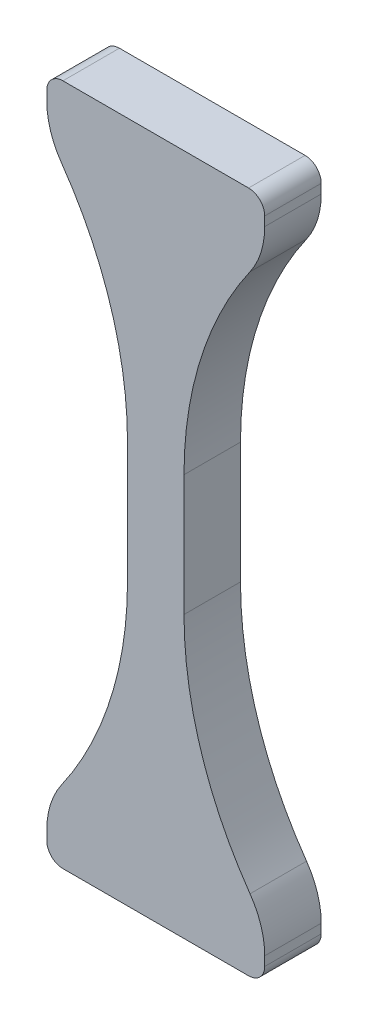
ISO-10303-21;
HEADER;
FILE_DESCRIPTION(('STEP AP214'),'2;1');
FILE_NAME('part.step','',(''),(''),'','','');
FILE_SCHEMA(('AUTOMOTIVE_DESIGN { 1 0 10303 214 1 1 1 1 }'));
ENDSEC;
DATA;
#1=APPLICATION_CONTEXT('core data for automotive mechanical design processes');
#2=APPLICATION_PROTOCOL_DEFINITION('international standard','automotive_design',2000,#1);
#3=PRODUCT_CONTEXT('',#1,'mechanical');
#4=PRODUCT('Part','Part','',(#3));
#5=PRODUCT_RELATED_PRODUCT_CATEGORY('part','',(#4));
#6=PRODUCT_DEFINITION_FORMATION('','',#4);
#7=PRODUCT_DEFINITION_CONTEXT('part definition',#1,'design');
#8=PRODUCT_DEFINITION('design','',#6,#7);
#9=PRODUCT_DEFINITION_SHAPE('','',#8);
#10=(LENGTH_UNIT() NAMED_UNIT(*) SI_UNIT(.MILLI.,.METRE.));
#11=(NAMED_UNIT(*) PLANE_ANGLE_UNIT() SI_UNIT($,.RADIAN.));
#12=(NAMED_UNIT(*) SI_UNIT($,.STERADIAN.) SOLID_ANGLE_UNIT());
#13=UNCERTAINTY_MEASURE_WITH_UNIT(LENGTH_MEASURE(1.E-05),#10,'distance_accuracy_value','');
#14=(GEOMETRIC_REPRESENTATION_CONTEXT(3) GLOBAL_UNCERTAINTY_ASSIGNED_CONTEXT((#13)) GLOBAL_UNIT_ASSIGNED_CONTEXT((#10,
#11,#12)) REPRESENTATION_CONTEXT('',''));
#15=CARTESIAN_POINT('',(0.,0.,0.));
#16=DIRECTION('',(0.,0.,1.));
#17=DIRECTION('',(1.,0.,0.));
#18=AXIS2_PLACEMENT_3D('',#15,#16,#17);
#19=CARTESIAN_POINT('',(3.5,-33.1428903165671,7.));
#20=DIRECTION('',(-1.,0.,0.));
#21=DIRECTION('',(0.,-1.,0.));
#22=AXIS2_PLACEMENT_3D('',#19,#20,#21);
#23=PLANE('',#22);
#24=DIRECTION('',(0.,1.,0.));
#25=VECTOR('',#24,1.);
#26=CARTESIAN_POINT('',(3.5,-33.1428903165671,0.));
#27=LINE('',#26,#25);
#28=CARTESIAN_POINT('',(3.5,-48.1428903165671,0.));
#29=VERTEX_POINT('',#28);
#30=CARTESIAN_POINT('',(3.5,-33.1428903165671,0.));
#31=VERTEX_POINT('',#30);
#32=EDGE_CURVE('E166',#29,#31,#27,.T.);
#33=ORIENTED_EDGE('',*,*,#32,.T.);
#34=DIRECTION('',(0.,0.,-1.));
#35=VECTOR('',#34,1.);
#36=CARTESIAN_POINT('',(3.5,-33.1428903165671,7.));
#37=LINE('',#36,#35);
#38=CARTESIAN_POINT('',(3.5,-33.1428903165671,7.));
#39=VERTEX_POINT('',#38);
#40=EDGE_CURVE('E11',#39,#31,#37,.T.);
#41=ORIENTED_EDGE('',*,*,#40,.F.);
#42=DIRECTION('',(0.,1.,0.));
#43=VECTOR('',#42,1.);
#44=CARTESIAN_POINT('',(3.5,-33.1428903165671,7.));
#45=LINE('',#44,#43);
#46=CARTESIAN_POINT('',(3.5,-48.1428903165671,7.));
#47=VERTEX_POINT('',#46);
#48=EDGE_CURVE('E112',#47,#39,#45,.T.);
#49=ORIENTED_EDGE('',*,*,#48,.F.);
#50=DIRECTION('',(0.,0.,-1.));
#51=VECTOR('',#50,1.);
#52=CARTESIAN_POINT('',(3.5,-48.1428903165671,7.));
#53=LINE('',#52,#51);
#54=EDGE_CURVE('E299',#47,#29,#53,.T.);
#55=ORIENTED_EDGE('',*,*,#54,.T.);
#56=EDGE_LOOP('',(#33,#41,#49,#55));
#57=FACE_BOUND('',#56,.T.);
#58=ADVANCED_FACE('F45',(#57),#23,.F.);
#59=CARTESIAN_POINT('',(48.5,-33.1428903165671,7.));
#60=DIRECTION('',(0.,0.,-1.));
#61=DIRECTION('',(-1.,0.,0.));
#62=AXIS2_PLACEMENT_3D('',#59,#60,#61);
#63=CYLINDRICAL_SURFACE('',#62,45.);
#64=CARTESIAN_POINT('',(48.5,-33.1428903165671,0.));
#65=DIRECTION('',(0.,0.,-1.));
#66=DIRECTION('',(1.,0.,0.));
#67=AXIS2_PLACEMENT_3D('',#64,#65,#66);
#68=CIRCLE('',#67,45.);
#69=CARTESIAN_POINT('',(11.6818181818182,-7.26970946064405,0.));
#70=VERTEX_POINT('',#69);
#71=EDGE_CURVE('E169',#31,#70,#68,.T.);
#72=ORIENTED_EDGE('',*,*,#71,.T.);
#73=DIRECTION('',(0.,0.,-1.));
#74=VECTOR('',#73,1.);
#75=CARTESIAN_POINT('',(11.6818181818182,-7.26970946064405,7.));
#76=LINE('',#75,#74);
#77=CARTESIAN_POINT('',(11.6818181818182,-7.26970946064405,7.));
#78=VERTEX_POINT('',#77);
#79=EDGE_CURVE('E54',#78,#70,#76,.T.);
#80=ORIENTED_EDGE('',*,*,#79,.F.);
#81=CARTESIAN_POINT('',(48.5,-33.1428903165671,7.));
#82=DIRECTION('',(0.,0.,-1.));
#83=DIRECTION('',(1.,0.,0.));
#84=AXIS2_PLACEMENT_3D('',#81,#82,#83);
#85=CIRCLE('',#84,45.);
#86=EDGE_CURVE('E259',#39,#78,#85,.T.);
#87=ORIENTED_EDGE('',*,*,#86,.F.);
#88=ORIENTED_EDGE('',*,*,#40,.T.);
#89=EDGE_LOOP('',(#72,#80,#87,#88));
#90=FACE_BOUND('',#89,.T.);
#91=ADVANCED_FACE('F432',(#90),#63,.F.);
#92=CARTESIAN_POINT('',(3.50000000000001,-1.52011371488336,7.));
#93=DIRECTION('',(0.,0.,-1.));
#94=DIRECTION('',(-1.,0.,0.));
#95=AXIS2_PLACEMENT_3D('',#92,#93,#94);
#96=CYLINDRICAL_SURFACE('',#95,10.);
#97=CARTESIAN_POINT('',(3.50000000000001,-1.52011371488336,0.));
#98=DIRECTION('',(0.,0.,1.));
#99=DIRECTION('',(-1.,0.,0.));
#100=AXIS2_PLACEMENT_3D('',#97,#98,#99);
#101=CIRCLE('',#100,10.);
#102=CARTESIAN_POINT('',(13.5,-1.52011371488336,0.));
#103=VERTEX_POINT('',#102);
#104=EDGE_CURVE('E173',#70,#103,#101,.T.);
#105=ORIENTED_EDGE('',*,*,#104,.T.);
#106=DIRECTION('',(0.,0.,-1.));
#107=VECTOR('',#106,1.);
#108=CARTESIAN_POINT('',(13.5,-1.52011371488336,7.));
#109=LINE('',#108,#107);
#110=CARTESIAN_POINT('',(13.5,-1.52011371488336,7.));
#111=VERTEX_POINT('',#110);
#112=EDGE_CURVE('E216',#111,#103,#109,.T.);
#113=ORIENTED_EDGE('',*,*,#112,.F.);
#114=CARTESIAN_POINT('',(3.50000000000001,-1.52011371488336,7.));
#115=DIRECTION('',(0.,0.,1.));
#116=DIRECTION('',(-1.,0.,0.));
#117=AXIS2_PLACEMENT_3D('',#114,#115,#116);
#118=CIRCLE('',#117,10.);
#119=EDGE_CURVE('E227',#78,#111,#118,.T.);
#120=ORIENTED_EDGE('',*,*,#119,.F.);
#121=ORIENTED_EDGE('',*,*,#79,.T.);
#122=EDGE_LOOP('',(#105,#113,#120,#121));
#123=FACE_BOUND('',#122,.T.);
#124=ADVANCED_FACE('F225',(#123),#96,.T.);
#125=CARTESIAN_POINT('',(13.5,-0.377223398316195,7.));
#126=DIRECTION('',(-1.,0.,0.));
#127=DIRECTION('',(0.,-1.,0.));
#128=AXIS2_PLACEMENT_3D('',#125,#126,#127);
#129=PLANE('',#128);
#130=DIRECTION('',(0.,1.,0.));
#131=VECTOR('',#130,1.);
#132=CARTESIAN_POINT('',(13.5,-0.377223398316195,0.));
#133=LINE('',#132,#131);
#134=CARTESIAN_POINT('',(13.5,-0.377223398316195,0.));
#135=VERTEX_POINT('',#134);
#136=EDGE_CURVE('E176',#103,#135,#133,.T.);
#137=ORIENTED_EDGE('',*,*,#136,.T.);
#138=DIRECTION('',(0.,0.,-1.));
#139=VECTOR('',#138,1.);
#140=CARTESIAN_POINT('',(13.5,-0.377223398316195,7.));
#141=LINE('',#140,#139);
#142=CARTESIAN_POINT('',(13.5,-0.377223398316195,7.));
#143=VERTEX_POINT('',#142);
#144=EDGE_CURVE('E212',#143,#135,#141,.T.);
#145=ORIENTED_EDGE('',*,*,#144,.F.);
#146=DIRECTION('',(0.,1.,0.));
#147=VECTOR('',#146,1.);
#148=CARTESIAN_POINT('',(13.5,-0.377223398316195,7.));
#149=LINE('',#148,#147);
#150=EDGE_CURVE('E249',#111,#143,#149,.T.);
#151=ORIENTED_EDGE('',*,*,#150,.F.);
#152=ORIENTED_EDGE('',*,*,#112,.T.);
#153=EDGE_LOOP('',(#137,#145,#151,#152));
#154=FACE_BOUND('',#153,.T.);
#155=ADVANCED_FACE('F239',(#154),#129,.F.);
#156=CARTESIAN_POINT('',(11.5,-0.377223398316195,7.));
#157=DIRECTION('',(0.,0.,-1.));
#158=DIRECTION('',(-1.,0.,0.));
#159=AXIS2_PLACEMENT_3D('',#156,#157,#158);
#160=CYLINDRICAL_SURFACE('',#159,2.);
#161=CARTESIAN_POINT('',(11.5,-0.377223398316195,0.));
#162=DIRECTION('',(0.,0.,1.));
#163=DIRECTION('',(-1.,0.,0.));
#164=AXIS2_PLACEMENT_3D('',#161,#162,#163);
#165=CIRCLE('',#164,2.);
#166=CARTESIAN_POINT('',(11.5,1.6227766016838,0.));
#167=VERTEX_POINT('',#166);
#168=EDGE_CURVE('E179',#135,#167,#165,.T.);
#169=ORIENTED_EDGE('',*,*,#168,.T.);
#170=DIRECTION('',(0.,0.,-1.));
#171=VECTOR('',#170,1.);
#172=CARTESIAN_POINT('',(11.5,1.6227766016838,7.));
#173=LINE('',#172,#171);
#174=CARTESIAN_POINT('',(11.5,1.6227766016838,7.));
#175=VERTEX_POINT('',#174);
#176=EDGE_CURVE('E208',#175,#167,#173,.T.);
#177=ORIENTED_EDGE('',*,*,#176,.F.);
#178=CARTESIAN_POINT('',(11.5,-0.377223398316195,7.));
#179=DIRECTION('',(0.,0.,1.));
#180=DIRECTION('',(-1.,0.,0.));
#181=AXIS2_PLACEMENT_3D('',#178,#179,#180);
#182=CIRCLE('',#181,2.);
#183=EDGE_CURVE('E245',#143,#175,#182,.T.);
#184=ORIENTED_EDGE('',*,*,#183,.F.);
#185=ORIENTED_EDGE('',*,*,#144,.T.);
#186=EDGE_LOOP('',(#169,#177,#184,#185));
#187=FACE_BOUND('',#186,.T.);
#188=ADVANCED_FACE('F243',(#187),#160,.T.);
#189=CARTESIAN_POINT('',(-11.5,1.6227766016838,7.));
#190=DIRECTION('',(0.,-1.,0.));
#191=DIRECTION('',(0.,0.,-1.));
#192=AXIS2_PLACEMENT_3D('',#189,#190,#191);
#193=PLANE('',#192);
#194=DIRECTION('',(-1.,0.,0.));
#195=VECTOR('',#194,1.);
#196=CARTESIAN_POINT('',(-11.5,1.6227766016838,0.));
#197=LINE('',#196,#195);
#198=CARTESIAN_POINT('',(-11.5,1.6227766016838,0.));
#199=VERTEX_POINT('',#198);
#200=EDGE_CURVE('E182',#167,#199,#197,.T.);
#201=ORIENTED_EDGE('',*,*,#200,.T.);
#202=DIRECTION('',(0.,0.,-1.));
#203=VECTOR('',#202,1.);
#204=CARTESIAN_POINT('',(-11.5,1.6227766016838,7.));
#205=LINE('',#204,#203);
#206=CARTESIAN_POINT('',(-11.5,1.6227766016838,7.));
#207=VERTEX_POINT('',#206);
#208=EDGE_CURVE('E204',#207,#199,#205,.T.);
#209=ORIENTED_EDGE('',*,*,#208,.F.);
#210=DIRECTION('',(-1.,0.,0.));
#211=VECTOR('',#210,1.);
#212=CARTESIAN_POINT('',(-11.5,1.6227766016838,7.));
#213=LINE('',#212,#211);
#214=EDGE_CURVE('E248',#175,#207,#213,.T.);
#215=ORIENTED_EDGE('',*,*,#214,.F.);
#216=ORIENTED_EDGE('',*,*,#176,.T.);
#217=EDGE_LOOP('',(#201,#209,#215,#216));
#218=FACE_BOUND('',#217,.T.);
#219=ADVANCED_FACE('F447',(#218),#193,.F.);
#220=CARTESIAN_POINT('',(-11.5,-0.377223398316195,7.));
#221=DIRECTION('',(0.,0.,-1.));
#222=DIRECTION('',(-1.,0.,0.));
#223=AXIS2_PLACEMENT_3D('',#220,#221,#222);
#224=CYLINDRICAL_SURFACE('',#223,2.);
#225=CARTESIAN_POINT('',(-11.5,-0.377223398316195,0.));
#226=DIRECTION('',(0.,0.,1.));
#227=DIRECTION('',(-1.,0.,0.));
#228=AXIS2_PLACEMENT_3D('',#225,#226,#227);
#229=CIRCLE('',#228,2.);
#230=CARTESIAN_POINT('',(-13.5,-0.377223398316195,0.));
#231=VERTEX_POINT('',#230);
#232=EDGE_CURVE('E185',#199,#231,#229,.T.);
#233=ORIENTED_EDGE('',*,*,#232,.T.);
#234=DIRECTION('',(0.,0.,-1.));
#235=VECTOR('',#234,1.);
#236=CARTESIAN_POINT('',(-13.5,-0.377223398316195,7.));
#237=LINE('',#236,#235);
#238=CARTESIAN_POINT('',(-13.5,-0.377223398316195,7.));
#239=VERTEX_POINT('',#238);
#240=EDGE_CURVE('E152',#239,#231,#237,.T.);
#241=ORIENTED_EDGE('',*,*,#240,.F.);
#242=CARTESIAN_POINT('',(-11.5,-0.377223398316195,7.));
#243=DIRECTION('',(0.,0.,1.));
#244=DIRECTION('',(-1.,0.,0.));
#245=AXIS2_PLACEMENT_3D('',#242,#243,#244);
#246=CIRCLE('',#245,2.);
#247=EDGE_CURVE('E141',#207,#239,#246,.T.);
#248=ORIENTED_EDGE('',*,*,#247,.F.);
#249=ORIENTED_EDGE('',*,*,#208,.T.);
#250=EDGE_LOOP('',(#233,#241,#248,#249));
#251=FACE_BOUND('',#250,.T.);
#252=ADVANCED_FACE('F450',(#251),#224,.T.);
#253=CARTESIAN_POINT('',(-13.5,-1.52011371488336,7.));
#254=DIRECTION('',(1.,0.,0.));
#255=DIRECTION('',(0.,1.,0.));
#256=AXIS2_PLACEMENT_3D('',#253,#254,#255);
#257=PLANE('',#256);
#258=DIRECTION('',(0.,-1.,0.));
#259=VECTOR('',#258,1.);
#260=CARTESIAN_POINT('',(-13.5,-1.52011371488336,0.));
#261=LINE('',#260,#259);
#262=CARTESIAN_POINT('',(-13.5,-1.52011371488336,0.));
#263=VERTEX_POINT('',#262);
#264=EDGE_CURVE('E150',#231,#263,#261,.T.);
#265=ORIENTED_EDGE('',*,*,#264,.T.);
#266=DIRECTION('',(0.,0.,-1.));
#267=VECTOR('',#266,1.);
#268=CARTESIAN_POINT('',(-13.5,-1.52011371488336,7.));
#269=LINE('',#268,#267);
#270=CARTESIAN_POINT('',(-13.5,-1.52011371488336,7.));
#271=VERTEX_POINT('',#270);
#272=EDGE_CURVE('E147',#271,#263,#269,.T.);
#273=ORIENTED_EDGE('',*,*,#272,.F.);
#274=DIRECTION('',(0.,-1.,0.));
#275=VECTOR('',#274,1.);
#276=CARTESIAN_POINT('',(-13.5,-1.52011371488336,7.));
#277=LINE('',#276,#275);
#278=EDGE_CURVE('E135',#239,#271,#277,.T.);
#279=ORIENTED_EDGE('',*,*,#278,.F.);
#280=ORIENTED_EDGE('',*,*,#240,.T.);
#281=EDGE_LOOP('',(#265,#273,#279,#280));
#282=FACE_BOUND('',#281,.T.);
#283=ADVANCED_FACE('F148',(#282),#257,.F.);
#284=CARTESIAN_POINT('',(-3.49999999999999,-1.52011371488336,7.));
#285=DIRECTION('',(0.,0.,-1.));
#286=DIRECTION('',(-1.,0.,0.));
#287=AXIS2_PLACEMENT_3D('',#284,#285,#286);
#288=CYLINDRICAL_SURFACE('',#287,10.);
#289=CARTESIAN_POINT('',(-3.49999999999999,-1.52011371488336,0.));
#290=DIRECTION('',(0.,0.,1.));
#291=DIRECTION('',(1.,0.,0.));
#292=AXIS2_PLACEMENT_3D('',#289,#290,#291);
#293=CIRCLE('',#292,10.);
#294=CARTESIAN_POINT('',(-11.6818181818182,-7.26970946064405,0.));
#295=VERTEX_POINT('',#294);
#296=EDGE_CURVE('E98',#263,#295,#293,.T.);
#297=ORIENTED_EDGE('',*,*,#296,.T.);
#298=DIRECTION('',(0.,0.,-1.));
#299=VECTOR('',#298,1.);
#300=CARTESIAN_POINT('',(-11.6818181818182,-7.26970946064405,7.));
#301=LINE('',#300,#299);
#302=CARTESIAN_POINT('',(-11.6818181818182,-7.26970946064405,7.));
#303=VERTEX_POINT('',#302);
#304=EDGE_CURVE('E153',#303,#295,#301,.T.);
#305=ORIENTED_EDGE('',*,*,#304,.F.);
#306=CARTESIAN_POINT('',(-3.49999999999999,-1.52011371488336,7.));
#307=DIRECTION('',(0.,0.,1.));
#308=DIRECTION('',(1.,0.,0.));
#309=AXIS2_PLACEMENT_3D('',#306,#307,#308);
#310=CIRCLE('',#309,10.);
#311=EDGE_CURVE('E139',#271,#303,#310,.T.);
#312=ORIENTED_EDGE('',*,*,#311,.F.);
#313=ORIENTED_EDGE('',*,*,#272,.T.);
#314=EDGE_LOOP('',(#297,#305,#312,#313));
#315=FACE_BOUND('',#314,.T.);
#316=ADVANCED_FACE('F155',(#315),#288,.T.);
#317=CARTESIAN_POINT('',(-48.5,-33.1428903165671,7.));
#318=DIRECTION('',(0.,0.,-1.));
#319=DIRECTION('',(-1.,0.,0.));
#320=AXIS2_PLACEMENT_3D('',#317,#318,#319);
#321=CYLINDRICAL_SURFACE('',#320,45.);
#322=CARTESIAN_POINT('',(-48.5,-33.1428903165671,0.));
#323=DIRECTION('',(0.,0.,-1.));
#324=DIRECTION('',(-1.,0.,0.));
#325=AXIS2_PLACEMENT_3D('',#322,#323,#324);
#326=CIRCLE('',#325,45.);
#327=CARTESIAN_POINT('',(-3.5,-33.1428903165671,0.));
#328=VERTEX_POINT('',#327);
#329=EDGE_CURVE('E104',#295,#328,#326,.T.);
#330=ORIENTED_EDGE('',*,*,#329,.T.);
#331=DIRECTION('',(0.,0.,-1.));
#332=VECTOR('',#331,1.);
#333=CARTESIAN_POINT('',(-3.5,-33.1428903165671,7.));
#334=LINE('',#333,#332);
#335=CARTESIAN_POINT('',(-3.5,-33.1428903165671,7.));
#336=VERTEX_POINT('',#335);
#337=EDGE_CURVE('E165',#336,#328,#334,.T.);
#338=ORIENTED_EDGE('',*,*,#337,.F.);
#339=CARTESIAN_POINT('',(-48.5,-33.1428903165671,7.));
#340=DIRECTION('',(0.,0.,-1.));
#341=DIRECTION('',(-1.,0.,0.));
#342=AXIS2_PLACEMENT_3D('',#339,#340,#341);
#343=CIRCLE('',#342,45.);
#344=EDGE_CURVE('E62',#303,#336,#343,.T.);
#345=ORIENTED_EDGE('',*,*,#344,.F.);
#346=ORIENTED_EDGE('',*,*,#304,.T.);
#347=EDGE_LOOP('',(#330,#338,#345,#346));
#348=FACE_BOUND('',#347,.T.);
#349=ADVANCED_FACE('F459',(#348),#321,.F.);
#350=CARTESIAN_POINT('',(-3.5,-40.6428903165671,7.));
#351=DIRECTION('',(1.,0.,0.));
#352=DIRECTION('',(0.,1.,0.));
#353=AXIS2_PLACEMENT_3D('',#350,#351,#352);
#354=PLANE('',#353);
#355=DIRECTION('',(0.,-1.,0.));
#356=VECTOR('',#355,1.);
#357=CARTESIAN_POINT('',(-3.5,-40.6428903165671,0.));
#358=LINE('',#357,#356);
#359=CARTESIAN_POINT('',(-3.5,-48.1428903165672,0.));
#360=VERTEX_POINT('',#359);
#361=EDGE_CURVE('E194',#328,#360,#358,.T.);
#362=ORIENTED_EDGE('',*,*,#361,.T.);
#363=DIRECTION('',(0.,0.,-1.));
#364=VECTOR('',#363,1.);
#365=CARTESIAN_POINT('',(-3.5,-48.1428903165672,7.));
#366=LINE('',#365,#364);
#367=CARTESIAN_POINT('',(-3.5,-48.1428903165672,7.));
#368=VERTEX_POINT('',#367);
#369=EDGE_CURVE('E170',#368,#360,#366,.T.);
#370=ORIENTED_EDGE('',*,*,#369,.F.);
#371=DIRECTION('',(0.,-1.,0.));
#372=VECTOR('',#371,1.);
#373=CARTESIAN_POINT('',(-3.5,-40.6428903165671,7.));
#374=LINE('',#373,#372);
#375=EDGE_CURVE('E159',#336,#368,#374,.T.);
#376=ORIENTED_EDGE('',*,*,#375,.F.);
#377=ORIENTED_EDGE('',*,*,#337,.T.);
#378=EDGE_LOOP('',(#362,#370,#376,#377));
#379=FACE_BOUND('',#378,.T.);
#380=ADVANCED_FACE('F461',(#379),#354,.F.);
#381=CARTESIAN_POINT('',(-48.5,-33.1428903165671,7.));
#382=DIRECTION('',(0.,0.,-1.));
#383=DIRECTION('',(-1.,0.,0.));
#384=AXIS2_PLACEMENT_3D('',#381,#382,#383);
#385=PLANE('',#384);
#386=ORIENTED_EDGE('',*,*,#375,.T.);
#387=CARTESIAN_POINT('',(-48.5,-48.1428903165671,7.));
#388=DIRECTION('',(0.,0.,1.));
#389=DIRECTION('',(-1.,0.,0.));
#390=AXIS2_PLACEMENT_3D('',#387,#388,#389);
#391=CIRCLE('',#390,45.);
#392=CARTESIAN_POINT('',(-11.6818181818182,-74.0160711724902,7.));
#393=VERTEX_POINT('',#392);
#394=EDGE_CURVE('E308',#393,#368,#391,.T.);
#395=ORIENTED_EDGE('',*,*,#394,.F.);
#396=CARTESIAN_POINT('',(-3.49999999999999,-79.7656669182509,7.));
#397=DIRECTION('',(0.,0.,-1.));
#398=DIRECTION('',(1.,0.,0.));
#399=AXIS2_PLACEMENT_3D('',#396,#397,#398);
#400=CIRCLE('',#399,10.);
#401=CARTESIAN_POINT('',(-13.5,-79.7656669182509,7.));
#402=VERTEX_POINT('',#401);
#403=EDGE_CURVE('E368',#402,#393,#400,.T.);
#404=ORIENTED_EDGE('',*,*,#403,.F.);
#405=DIRECTION('',(0.,1.,0.));
#406=VECTOR('',#405,1.);
#407=CARTESIAN_POINT('',(-13.5,-79.7656669182509,7.));
#408=LINE('',#407,#406);
#409=CARTESIAN_POINT('',(-13.5,-80.9085572348181,7.));
#410=VERTEX_POINT('',#409);
#411=EDGE_CURVE('E364',#410,#402,#408,.T.);
#412=ORIENTED_EDGE('',*,*,#411,.F.);
#413=CARTESIAN_POINT('',(-11.5,-80.9085572348181,7.));
#414=DIRECTION('',(0.,0.,-1.));
#415=DIRECTION('',(-1.,0.,0.));
#416=AXIS2_PLACEMENT_3D('',#413,#414,#415);
#417=CIRCLE('',#416,2.);
#418=CARTESIAN_POINT('',(-11.5,-82.9085572348181,7.));
#419=VERTEX_POINT('',#418);
#420=EDGE_CURVE('E360',#419,#410,#417,.T.);
#421=ORIENTED_EDGE('',*,*,#420,.F.);
#422=DIRECTION('',(-1.,0.,0.));
#423=VECTOR('',#422,1.);
#424=CARTESIAN_POINT('',(-11.5,-82.9085572348181,7.));
#425=LINE('',#424,#423);
#426=CARTESIAN_POINT('',(11.5,-82.9085572348181,7.));
#427=VERTEX_POINT('',#426);
#428=EDGE_CURVE('E356',#427,#419,#425,.T.);
#429=ORIENTED_EDGE('',*,*,#428,.F.);
#430=CARTESIAN_POINT('',(11.5,-80.9085572348181,7.));
#431=DIRECTION('',(0.,0.,-1.));
#432=DIRECTION('',(-1.,0.,0.));
#433=AXIS2_PLACEMENT_3D('',#430,#431,#432);
#434=CIRCLE('',#433,2.);
#435=CARTESIAN_POINT('',(13.5,-80.9085572348181,7.));
#436=VERTEX_POINT('',#435);
#437=EDGE_CURVE('E352',#436,#427,#434,.T.);
#438=ORIENTED_EDGE('',*,*,#437,.F.);
#439=DIRECTION('',(0.,-1.,0.));
#440=VECTOR('',#439,1.);
#441=CARTESIAN_POINT('',(13.5,-80.9085572348181,7.));
#442=LINE('',#441,#440);
#443=CARTESIAN_POINT('',(13.5,-79.7656669182509,7.));
#444=VERTEX_POINT('',#443);
#445=EDGE_CURVE('E348',#444,#436,#442,.T.);
#446=ORIENTED_EDGE('',*,*,#445,.F.);
#447=CARTESIAN_POINT('',(3.50000000000001,-79.7656669182509,7.));
#448=DIRECTION('',(0.,0.,-1.));
#449=DIRECTION('',(-1.,0.,0.));
#450=AXIS2_PLACEMENT_3D('',#447,#448,#449);
#451=CIRCLE('',#450,10.);
#452=CARTESIAN_POINT('',(11.6818181818182,-74.0160711724902,7.));
#453=VERTEX_POINT('',#452);
#454=EDGE_CURVE('E344',#453,#444,#451,.T.);
#455=ORIENTED_EDGE('',*,*,#454,.F.);
#456=CARTESIAN_POINT('',(48.5,-48.1428903165671,7.));
#457=DIRECTION('',(0.,0.,1.));
#458=DIRECTION('',(1.,0.,0.));
#459=AXIS2_PLACEMENT_3D('',#456,#457,#458);
#460=CIRCLE('',#459,45.);
#461=EDGE_CURVE('E303',#47,#453,#460,.T.);
#462=ORIENTED_EDGE('',*,*,#461,.F.);
#463=ORIENTED_EDGE('',*,*,#48,.T.);
#464=ORIENTED_EDGE('',*,*,#86,.T.);
#465=ORIENTED_EDGE('',*,*,#119,.T.);
#466=ORIENTED_EDGE('',*,*,#150,.T.);
#467=ORIENTED_EDGE('',*,*,#183,.T.);
#468=ORIENTED_EDGE('',*,*,#214,.T.);
#469=ORIENTED_EDGE('',*,*,#247,.T.);
#470=ORIENTED_EDGE('',*,*,#278,.T.);
#471=ORIENTED_EDGE('',*,*,#311,.T.);
#472=ORIENTED_EDGE('',*,*,#344,.T.);
#473=EDGE_LOOP('',(#386,#395,#404,#412,#421,#429,#438,#446,#455,#462,#463,#464,#465,#466,#467,
#468,#469,#470,#471,#472));
#474=FACE_BOUND('',#473,.T.);
#475=ADVANCED_FACE('F137',(#474),#385,.F.);
#476=CARTESIAN_POINT('',(-48.5,-33.1428903165671,0.));
#477=DIRECTION('',(0.,0.,-1.));
#478=DIRECTION('',(-1.,0.,0.));
#479=AXIS2_PLACEMENT_3D('',#476,#477,#478);
#480=PLANE('',#479);
#481=ORIENTED_EDGE('',*,*,#32,.F.);
#482=CARTESIAN_POINT('',(48.5,-48.1428903165671,0.));
#483=DIRECTION('',(0.,0.,1.));
#484=DIRECTION('',(1.,0.,0.));
#485=AXIS2_PLACEMENT_3D('',#482,#483,#484);
#486=CIRCLE('',#485,45.);
#487=CARTESIAN_POINT('',(11.6818181818182,-74.0160711724902,0.));
#488=VERTEX_POINT('',#487);
#489=EDGE_CURVE('E304',#29,#488,#486,.T.);
#490=ORIENTED_EDGE('',*,*,#489,.T.);
#491=CARTESIAN_POINT('',(3.50000000000001,-79.7656669182509,0.));
#492=DIRECTION('',(0.,0.,-1.));
#493=DIRECTION('',(-1.,0.,0.));
#494=AXIS2_PLACEMENT_3D('',#491,#492,#493);
#495=CIRCLE('',#494,10.);
#496=CARTESIAN_POINT('',(13.5,-79.7656669182509,0.));
#497=VERTEX_POINT('',#496);
#498=EDGE_CURVE('E309',#488,#497,#495,.T.);
#499=ORIENTED_EDGE('',*,*,#498,.T.);
#500=DIRECTION('',(0.,-1.,0.));
#501=VECTOR('',#500,1.);
#502=CARTESIAN_POINT('',(13.5,-80.9085572348181,0.));
#503=LINE('',#502,#501);
#504=CARTESIAN_POINT('',(13.5,-80.9085572348181,0.));
#505=VERTEX_POINT('',#504);
#506=EDGE_CURVE('E313',#497,#505,#503,.T.);
#507=ORIENTED_EDGE('',*,*,#506,.T.);
#508=CARTESIAN_POINT('',(11.5,-80.9085572348181,0.));
#509=DIRECTION('',(0.,0.,-1.));
#510=DIRECTION('',(-1.,0.,0.));
#511=AXIS2_PLACEMENT_3D('',#508,#509,#510);
#512=CIRCLE('',#511,2.);
#513=CARTESIAN_POINT('',(11.5,-82.9085572348181,0.));
#514=VERTEX_POINT('',#513);
#515=EDGE_CURVE('E317',#505,#514,#512,.T.);
#516=ORIENTED_EDGE('',*,*,#515,.T.);
#517=DIRECTION('',(-1.,0.,0.));
#518=VECTOR('',#517,1.);
#519=CARTESIAN_POINT('',(-11.5,-82.9085572348181,0.));
#520=LINE('',#519,#518);
#521=CARTESIAN_POINT('',(-11.5,-82.9085572348181,0.));
#522=VERTEX_POINT('',#521);
#523=EDGE_CURVE('E321',#514,#522,#520,.T.);
#524=ORIENTED_EDGE('',*,*,#523,.T.);
#525=CARTESIAN_POINT('',(-11.5,-80.9085572348181,0.));
#526=DIRECTION('',(0.,0.,-1.));
#527=DIRECTION('',(-1.,0.,0.));
#528=AXIS2_PLACEMENT_3D('',#525,#526,#527);
#529=CIRCLE('',#528,2.);
#530=CARTESIAN_POINT('',(-13.5,-80.9085572348181,0.));
#531=VERTEX_POINT('',#530);
#532=EDGE_CURVE('E325',#522,#531,#529,.T.);
#533=ORIENTED_EDGE('',*,*,#532,.T.);
#534=DIRECTION('',(0.,1.,0.));
#535=VECTOR('',#534,1.);
#536=CARTESIAN_POINT('',(-13.5,-79.7656669182509,0.));
#537=LINE('',#536,#535);
#538=CARTESIAN_POINT('',(-13.5,-79.7656669182509,0.));
#539=VERTEX_POINT('',#538);
#540=EDGE_CURVE('E329',#531,#539,#537,.T.);
#541=ORIENTED_EDGE('',*,*,#540,.T.);
#542=CARTESIAN_POINT('',(-3.49999999999999,-79.7656669182509,0.));
#543=DIRECTION('',(0.,0.,-1.));
#544=DIRECTION('',(1.,0.,0.));
#545=AXIS2_PLACEMENT_3D('',#542,#543,#544);
#546=CIRCLE('',#545,10.);
#547=CARTESIAN_POINT('',(-11.6818181818182,-74.0160711724902,0.));
#548=VERTEX_POINT('',#547);
#549=EDGE_CURVE('E333',#539,#548,#546,.T.);
#550=ORIENTED_EDGE('',*,*,#549,.T.);
#551=CARTESIAN_POINT('',(-48.5,-48.1428903165671,0.));
#552=DIRECTION('',(0.,0.,1.));
#553=DIRECTION('',(-1.,0.,0.));
#554=AXIS2_PLACEMENT_3D('',#551,#552,#553);
#555=CIRCLE('',#554,45.);
#556=EDGE_CURVE('E337',#548,#360,#555,.T.);
#557=ORIENTED_EDGE('',*,*,#556,.T.);
#558=ORIENTED_EDGE('',*,*,#361,.F.);
#559=ORIENTED_EDGE('',*,*,#329,.F.);
#560=ORIENTED_EDGE('',*,*,#296,.F.);
#561=ORIENTED_EDGE('',*,*,#264,.F.);
#562=ORIENTED_EDGE('',*,*,#232,.F.);
#563=ORIENTED_EDGE('',*,*,#200,.F.);
#564=ORIENTED_EDGE('',*,*,#168,.F.);
#565=ORIENTED_EDGE('',*,*,#136,.F.);
#566=ORIENTED_EDGE('',*,*,#104,.F.);
#567=ORIENTED_EDGE('',*,*,#71,.F.);
#568=EDGE_LOOP('',(#481,#490,#499,#507,#516,#524,#533,#541,#550,#557,#558,#559,#560,#561,#562,
#563,#564,#565,#566,#567));
#569=FACE_BOUND('',#568,.T.);
#570=ADVANCED_FACE('F234',(#569),#480,.T.);
#571=CARTESIAN_POINT('',(-48.5,-48.1428903165671,7.));
#572=DIRECTION('',(0.,0.,-1.));
#573=DIRECTION('',(-1.,0.,0.));
#574=AXIS2_PLACEMENT_3D('',#571,#572,#573);
#575=CYLINDRICAL_SURFACE('',#574,45.);
#576=ORIENTED_EDGE('',*,*,#556,.F.);
#577=DIRECTION('',(0.,0.,-1.));
#578=VECTOR('',#577,1.);
#579=CARTESIAN_POINT('',(-11.6818181818182,-74.0160711724902,7.));
#580=LINE('',#579,#578);
#581=EDGE_CURVE('E267',#393,#548,#580,.T.);
#582=ORIENTED_EDGE('',*,*,#581,.F.);
#583=ORIENTED_EDGE('',*,*,#394,.T.);
#584=ORIENTED_EDGE('',*,*,#369,.T.);
#585=EDGE_LOOP('',(#576,#582,#583,#584));
#586=FACE_BOUND('',#585,.T.);
#587=ADVANCED_FACE('F379',(#586),#575,.F.);
#588=CARTESIAN_POINT('',(-3.49999999999999,-79.7656669182509,7.));
#589=DIRECTION('',(0.,0.,-1.));
#590=DIRECTION('',(-1.,0.,0.));
#591=AXIS2_PLACEMENT_3D('',#588,#589,#590);
#592=CYLINDRICAL_SURFACE('',#591,10.);
#593=ORIENTED_EDGE('',*,*,#549,.F.);
#594=DIRECTION('',(0.,0.,-1.));
#595=VECTOR('',#594,1.);
#596=CARTESIAN_POINT('',(-13.5,-79.7656669182509,7.));
#597=LINE('',#596,#595);
#598=EDGE_CURVE('E271',#402,#539,#597,.T.);
#599=ORIENTED_EDGE('',*,*,#598,.F.);
#600=ORIENTED_EDGE('',*,*,#403,.T.);
#601=ORIENTED_EDGE('',*,*,#581,.T.);
#602=EDGE_LOOP('',(#593,#599,#600,#601));
#603=FACE_BOUND('',#602,.T.);
#604=ADVANCED_FACE('F392',(#603),#592,.T.);
#605=CARTESIAN_POINT('',(-13.5,-79.7656669182509,7.));
#606=DIRECTION('',(-1.,0.,0.));
#607=DIRECTION('',(0.,-1.,0.));
#608=AXIS2_PLACEMENT_3D('',#605,#606,#607);
#609=PLANE('',#608);
#610=ORIENTED_EDGE('',*,*,#540,.F.);
#611=DIRECTION('',(0.,0.,-1.));
#612=VECTOR('',#611,1.);
#613=CARTESIAN_POINT('',(-13.5,-80.9085572348181,7.));
#614=LINE('',#613,#612);
#615=EDGE_CURVE('E275',#410,#531,#614,.T.);
#616=ORIENTED_EDGE('',*,*,#615,.F.);
#617=ORIENTED_EDGE('',*,*,#411,.T.);
#618=ORIENTED_EDGE('',*,*,#598,.T.);
#619=EDGE_LOOP('',(#610,#616,#617,#618));
#620=FACE_BOUND('',#619,.T.);
#621=ADVANCED_FACE('F399',(#620),#609,.T.);
#622=CARTESIAN_POINT('',(-11.5,-80.9085572348181,7.));
#623=DIRECTION('',(0.,0.,-1.));
#624=DIRECTION('',(-1.,0.,0.));
#625=AXIS2_PLACEMENT_3D('',#622,#623,#624);
#626=CYLINDRICAL_SURFACE('',#625,2.);
#627=ORIENTED_EDGE('',*,*,#532,.F.);
#628=DIRECTION('',(0.,0.,-1.));
#629=VECTOR('',#628,1.);
#630=CARTESIAN_POINT('',(-11.5,-82.9085572348181,7.));
#631=LINE('',#630,#629);
#632=EDGE_CURVE('E279',#419,#522,#631,.T.);
#633=ORIENTED_EDGE('',*,*,#632,.F.);
#634=ORIENTED_EDGE('',*,*,#420,.T.);
#635=ORIENTED_EDGE('',*,*,#615,.T.);
#636=EDGE_LOOP('',(#627,#633,#634,#635));
#637=FACE_BOUND('',#636,.T.);
#638=ADVANCED_FACE('F474',(#637),#626,.T.);
#639=CARTESIAN_POINT('',(-11.5,-82.9085572348181,7.));
#640=DIRECTION('',(0.,-1.,0.));
#641=DIRECTION('',(0.,0.,-1.));
#642=AXIS2_PLACEMENT_3D('',#639,#640,#641);
#643=PLANE('',#642);
#644=ORIENTED_EDGE('',*,*,#523,.F.);
#645=DIRECTION('',(0.,0.,-1.));
#646=VECTOR('',#645,1.);
#647=CARTESIAN_POINT('',(11.5,-82.9085572348181,7.));
#648=LINE('',#647,#646);
#649=EDGE_CURVE('E283',#427,#514,#648,.T.);
#650=ORIENTED_EDGE('',*,*,#649,.F.);
#651=ORIENTED_EDGE('',*,*,#428,.T.);
#652=ORIENTED_EDGE('',*,*,#632,.T.);
#653=EDGE_LOOP('',(#644,#650,#651,#652));
#654=FACE_BOUND('',#653,.T.);
#655=ADVANCED_FACE('F477',(#654),#643,.T.);
#656=CARTESIAN_POINT('',(11.5,-80.9085572348181,7.));
#657=DIRECTION('',(0.,0.,-1.));
#658=DIRECTION('',(-1.,0.,0.));
#659=AXIS2_PLACEMENT_3D('',#656,#657,#658);
#660=CYLINDRICAL_SURFACE('',#659,2.);
#661=ORIENTED_EDGE('',*,*,#515,.F.);
#662=DIRECTION('',(0.,0.,-1.));
#663=VECTOR('',#662,1.);
#664=CARTESIAN_POINT('',(13.5,-80.9085572348181,7.));
#665=LINE('',#664,#663);
#666=EDGE_CURVE('E287',#436,#505,#665,.T.);
#667=ORIENTED_EDGE('',*,*,#666,.F.);
#668=ORIENTED_EDGE('',*,*,#437,.T.);
#669=ORIENTED_EDGE('',*,*,#649,.T.);
#670=EDGE_LOOP('',(#661,#667,#668,#669));
#671=FACE_BOUND('',#670,.T.);
#672=ADVANCED_FACE('F481',(#671),#660,.T.);
#673=CARTESIAN_POINT('',(13.5,-80.9085572348181,7.));
#674=DIRECTION('',(1.,0.,0.));
#675=DIRECTION('',(0.,1.,0.));
#676=AXIS2_PLACEMENT_3D('',#673,#674,#675);
#677=PLANE('',#676);
#678=ORIENTED_EDGE('',*,*,#506,.F.);
#679=DIRECTION('',(0.,0.,-1.));
#680=VECTOR('',#679,1.);
#681=CARTESIAN_POINT('',(13.5,-79.7656669182509,7.));
#682=LINE('',#681,#680);
#683=EDGE_CURVE('E291',#444,#497,#682,.T.);
#684=ORIENTED_EDGE('',*,*,#683,.F.);
#685=ORIENTED_EDGE('',*,*,#445,.T.);
#686=ORIENTED_EDGE('',*,*,#666,.T.);
#687=EDGE_LOOP('',(#678,#684,#685,#686));
#688=FACE_BOUND('',#687,.T.);
#689=ADVANCED_FACE('F428',(#688),#677,.T.);
#690=CARTESIAN_POINT('',(3.50000000000001,-79.7656669182509,7.));
#691=DIRECTION('',(0.,0.,-1.));
#692=DIRECTION('',(-1.,0.,0.));
#693=AXIS2_PLACEMENT_3D('',#690,#691,#692);
#694=CYLINDRICAL_SURFACE('',#693,10.);
#695=ORIENTED_EDGE('',*,*,#498,.F.);
#696=DIRECTION('',(0.,0.,-1.));
#697=VECTOR('',#696,1.);
#698=CARTESIAN_POINT('',(11.6818181818182,-74.0160711724902,7.));
#699=LINE('',#698,#697);
#700=EDGE_CURVE('E295',#453,#488,#699,.T.);
#701=ORIENTED_EDGE('',*,*,#700,.F.);
#702=ORIENTED_EDGE('',*,*,#454,.T.);
#703=ORIENTED_EDGE('',*,*,#683,.T.);
#704=EDGE_LOOP('',(#695,#701,#702,#703));
#705=FACE_BOUND('',#704,.T.);
#706=ADVANCED_FACE('F423',(#705),#694,.T.);
#707=CARTESIAN_POINT('',(48.5,-48.1428903165671,7.));
#708=DIRECTION('',(0.,0.,-1.));
#709=DIRECTION('',(-1.,0.,0.));
#710=AXIS2_PLACEMENT_3D('',#707,#708,#709);
#711=CYLINDRICAL_SURFACE('',#710,45.);
#712=ORIENTED_EDGE('',*,*,#489,.F.);
#713=ORIENTED_EDGE('',*,*,#54,.F.);
#714=ORIENTED_EDGE('',*,*,#461,.T.);
#715=ORIENTED_EDGE('',*,*,#700,.T.);
#716=EDGE_LOOP('',(#712,#713,#714,#715));
#717=FACE_BOUND('',#716,.T.);
#718=ADVANCED_FACE('F421',(#717),#711,.F.);
#719=CLOSED_SHELL('',(#58,#91,#124,#155,#188,#219,#252,#283,#316,#349,#380,#475,#570,#587,#604,
#621,#638,#655,#672,#689,#706,#718));
#720=MANIFOLD_SOLID_BREP('B2',#719);
#721=ADVANCED_BREP_SHAPE_REPRESENTATION('',(#18,#720),#14);
#722=SHAPE_DEFINITION_REPRESENTATION(#9,#721);
ENDSEC;
END-ISO-10303-21;
